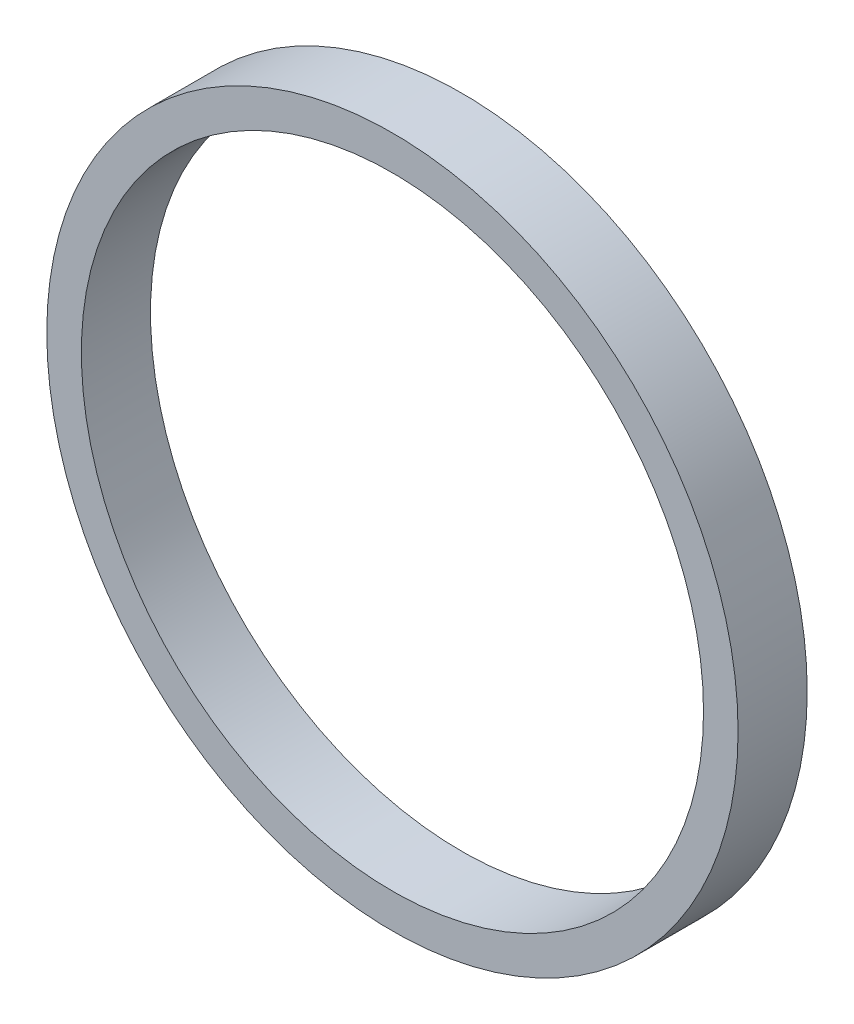
ISO-10303-21;
HEADER;
FILE_DESCRIPTION(('STEP AP214'),'2;1');
FILE_NAME('part.step','',(''),(''),'','','');
FILE_SCHEMA(('AUTOMOTIVE_DESIGN { 1 0 10303 214 1 1 1 1 }'));
ENDSEC;
DATA;
#1=APPLICATION_CONTEXT('core data for automotive mechanical design processes');
#2=APPLICATION_PROTOCOL_DEFINITION('international standard','automotive_design',2000,#1);
#3=PRODUCT_CONTEXT('',#1,'mechanical');
#4=PRODUCT('Part','Part','',(#3));
#5=PRODUCT_RELATED_PRODUCT_CATEGORY('part','',(#4));
#6=PRODUCT_DEFINITION_FORMATION('','',#4);
#7=PRODUCT_DEFINITION_CONTEXT('part definition',#1,'design');
#8=PRODUCT_DEFINITION('design','',#6,#7);
#9=PRODUCT_DEFINITION_SHAPE('','',#8);
#10=(LENGTH_UNIT() NAMED_UNIT(*) SI_UNIT(.MILLI.,.METRE.));
#11=(NAMED_UNIT(*) PLANE_ANGLE_UNIT() SI_UNIT($,.RADIAN.));
#12=(NAMED_UNIT(*) SI_UNIT($,.STERADIAN.) SOLID_ANGLE_UNIT());
#13=UNCERTAINTY_MEASURE_WITH_UNIT(LENGTH_MEASURE(1.E-05),#10,'distance_accuracy_value','');
#14=(GEOMETRIC_REPRESENTATION_CONTEXT(3) GLOBAL_UNCERTAINTY_ASSIGNED_CONTEXT((#13)) GLOBAL_UNIT_ASSIGNED_CONTEXT((#10,
#11,#12)) REPRESENTATION_CONTEXT('',''));
#15=CARTESIAN_POINT('',(0.,0.,0.));
#16=DIRECTION('',(0.,0.,1.));
#17=DIRECTION('',(1.,0.,0.));
#18=AXIS2_PLACEMENT_3D('',#15,#16,#17);
#19=CARTESIAN_POINT('',(0.,0.,10.));
#20=DIRECTION('',(0.,0.,1.));
#21=DIRECTION('',(1.,0.,0.));
#22=AXIS2_PLACEMENT_3D('',#19,#20,#21);
#23=PLANE('',#22);
#24=CARTESIAN_POINT('',(0.,0.,10.));
#25=DIRECTION('',(0.,0.,1.));
#26=DIRECTION('',(1.,0.,0.));
#27=AXIS2_PLACEMENT_3D('',#24,#25,#26);
#28=CIRCLE('',#27,50.);
#29=CARTESIAN_POINT('',(50.,0.,10.));
#30=VERTEX_POINT('',#29);
#31=EDGE_CURVE('E10',#30,#30,#28,.T.);
#32=ORIENTED_EDGE('',*,*,#31,.T.);
#33=EDGE_LOOP('',(#32));
#34=FACE_BOUND('',#33,.T.);
#35=CARTESIAN_POINT('',(0.,0.,10.));
#36=DIRECTION('',(0.,0.,1.));
#37=DIRECTION('',(1.,0.,0.));
#38=AXIS2_PLACEMENT_3D('',#35,#36,#37);
#39=CIRCLE('',#38,45.);
#40=CARTESIAN_POINT('',(45.,0.,10.));
#41=VERTEX_POINT('',#40);
#42=EDGE_CURVE('E50',#41,#41,#39,.T.);
#43=ORIENTED_EDGE('',*,*,#42,.F.);
#44=EDGE_LOOP('',(#43));
#45=FACE_BOUND('',#44,.T.);
#46=ADVANCED_FACE('F37',(#34,#45),#23,.T.);
#47=CARTESIAN_POINT('',(0.,0.,0.));
#48=DIRECTION('',(0.,0.,1.));
#49=DIRECTION('',(1.,0.,0.));
#50=AXIS2_PLACEMENT_3D('',#47,#48,#49);
#51=PLANE('',#50);
#52=CARTESIAN_POINT('',(0.,0.,0.));
#53=DIRECTION('',(0.,0.,1.));
#54=DIRECTION('',(1.,0.,0.));
#55=AXIS2_PLACEMENT_3D('',#52,#53,#54);
#56=CIRCLE('',#55,50.);
#57=CARTESIAN_POINT('',(50.,0.,0.));
#58=VERTEX_POINT('',#57);
#59=EDGE_CURVE('E41',#58,#58,#56,.T.);
#60=ORIENTED_EDGE('',*,*,#59,.F.);
#61=EDGE_LOOP('',(#60));
#62=FACE_BOUND('',#61,.T.);
#63=CARTESIAN_POINT('',(0.,0.,0.));
#64=DIRECTION('',(0.,0.,1.));
#65=DIRECTION('',(1.,0.,0.));
#66=AXIS2_PLACEMENT_3D('',#63,#64,#65);
#67=CIRCLE('',#66,45.);
#68=CARTESIAN_POINT('',(45.,0.,0.));
#69=VERTEX_POINT('',#68);
#70=EDGE_CURVE('E52',#69,#69,#67,.T.);
#71=ORIENTED_EDGE('',*,*,#70,.T.);
#72=EDGE_LOOP('',(#71));
#73=FACE_BOUND('',#72,.T.);
#74=ADVANCED_FACE('F64',(#62,#73),#51,.F.);
#75=CARTESIAN_POINT('',(0.,0.,10.));
#76=DIRECTION('',(0.,0.,-1.));
#77=DIRECTION('',(-1.,0.,0.));
#78=AXIS2_PLACEMENT_3D('',#75,#76,#77);
#79=CYLINDRICAL_SURFACE('',#78,50.);
#80=ORIENTED_EDGE('',*,*,#31,.F.);
#81=EDGE_LOOP('',(#80));
#82=FACE_BOUND('',#81,.T.);
#83=ORIENTED_EDGE('',*,*,#59,.T.);
#84=EDGE_LOOP('',(#83));
#85=FACE_BOUND('',#84,.T.);
#86=ADVANCED_FACE('F39',(#82,#85),#79,.T.);
#87=CARTESIAN_POINT('',(0.,0.,10.));
#88=DIRECTION('',(0.,0.,-1.));
#89=DIRECTION('',(-1.,0.,0.));
#90=AXIS2_PLACEMENT_3D('',#87,#88,#89);
#91=CYLINDRICAL_SURFACE('',#90,45.);
#92=ORIENTED_EDGE('',*,*,#42,.T.);
#93=EDGE_LOOP('',(#92));
#94=FACE_BOUND('',#93,.T.);
#95=ORIENTED_EDGE('',*,*,#70,.F.);
#96=EDGE_LOOP('',(#95));
#97=FACE_BOUND('',#96,.T.);
#98=ADVANCED_FACE('F60',(#94,#97),#91,.F.);
#99=CLOSED_SHELL('',(#46,#74,#86,#98));
#100=MANIFOLD_SOLID_BREP('B2',#99);
#101=ADVANCED_BREP_SHAPE_REPRESENTATION('',(#18,#100),#14);
#102=SHAPE_DEFINITION_REPRESENTATION(#9,#101);
ENDSEC;
END-ISO-10303-21;
